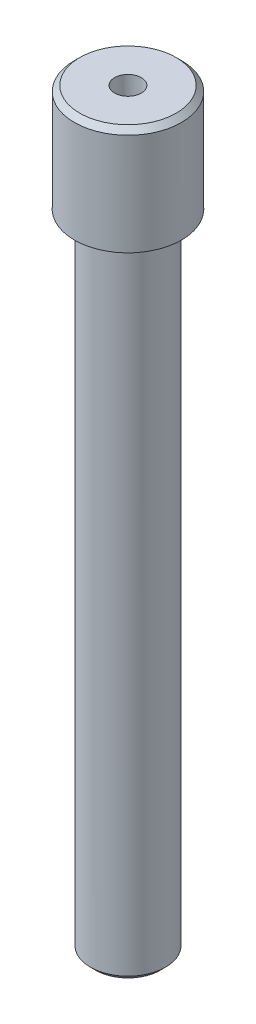
ISO-10303-21;
HEADER;
FILE_DESCRIPTION(('STEP AP214'),'2;1');
FILE_NAME('part.step','',(''),(''),'','','');
FILE_SCHEMA(('AUTOMOTIVE_DESIGN { 1 0 10303 214 1 1 1 1 }'));
ENDSEC;
DATA;
#1=APPLICATION_CONTEXT('core data for automotive mechanical design processes');
#2=APPLICATION_PROTOCOL_DEFINITION('international standard','automotive_design',2000,#1);
#3=PRODUCT_CONTEXT('',#1,'mechanical');
#4=PRODUCT('Part','Part','',(#3));
#5=PRODUCT_RELATED_PRODUCT_CATEGORY('part','',(#4));
#6=PRODUCT_DEFINITION_FORMATION('','',#4);
#7=PRODUCT_DEFINITION_CONTEXT('part definition',#1,'design');
#8=PRODUCT_DEFINITION('design','',#6,#7);
#9=PRODUCT_DEFINITION_SHAPE('','',#8);
#10=(LENGTH_UNIT() NAMED_UNIT(*) SI_UNIT(.MILLI.,.METRE.));
#11=(NAMED_UNIT(*) PLANE_ANGLE_UNIT() SI_UNIT($,.RADIAN.));
#12=(NAMED_UNIT(*) SI_UNIT($,.STERADIAN.) SOLID_ANGLE_UNIT());
#13=UNCERTAINTY_MEASURE_WITH_UNIT(LENGTH_MEASURE(1.E-05),#10,'distance_accuracy_value','');
#14=(GEOMETRIC_REPRESENTATION_CONTEXT(3) GLOBAL_UNCERTAINTY_ASSIGNED_CONTEXT((#13)) GLOBAL_UNIT_ASSIGNED_CONTEXT((#10,
#11,#12)) REPRESENTATION_CONTEXT('',''));
#15=CARTESIAN_POINT('',(0.,0.,0.));
#16=DIRECTION('',(0.,0.,1.));
#17=DIRECTION('',(1.,0.,0.));
#18=AXIS2_PLACEMENT_3D('',#15,#16,#17);
#19=CARTESIAN_POINT('',(0.,102.6727408751,0.));
#20=DIRECTION('',(0.,1.,0.));
#21=DIRECTION('',(0.,0.,1.));
#22=AXIS2_PLACEMENT_3D('',#19,#20,#21);
#23=CYLINDRICAL_SURFACE('',#22,3.);
#24=CARTESIAN_POINT('',(0.,120.,0.));
#25=DIRECTION('',(0.,1.,0.));
#26=DIRECTION('',(0.,0.,1.));
#27=AXIS2_PLACEMENT_3D('',#24,#25,#26);
#28=CIRCLE('',#27,3.);
#29=CARTESIAN_POINT('',(0.,120.,3.));
#30=VERTEX_POINT('',#29);
#31=EDGE_CURVE('P0_E11',#30,#30,#28,.F.);
#32=ORIENTED_EDGE('',*,*,#31,.T.);
#33=EDGE_LOOP('',(#32));
#34=FACE_BOUND('',#33,.T.);
#35=CARTESIAN_POINT('',(0.,108.,0.));
#36=DIRECTION('',(0.,1.,0.));
#37=DIRECTION('',(0.,0.,1.));
#38=AXIS2_PLACEMENT_3D('',#35,#36,#37);
#39=CIRCLE('',#38,3.);
#40=CARTESIAN_POINT('',(0.,108.,3.));
#41=VERTEX_POINT('',#40);
#42=EDGE_CURVE('P0_E20',#41,#41,#39,.T.);
#43=ORIENTED_EDGE('',*,*,#42,.T.);
#44=EDGE_LOOP('',(#43));
#45=FACE_BOUND('',#44,.T.);
#46=ADVANCED_FACE('P0_F16',(#34,#45),#23,.T.);
#47=CARTESIAN_POINT('',(0.,108.,0.));
#48=DIRECTION('',(0.,1.,0.));
#49=DIRECTION('',(1.,0.,0.));
#50=AXIS2_PLACEMENT_3D('',#47,#48,#49);
#51=PLANE('',#50);
#52=ORIENTED_EDGE('',*,*,#42,.F.);
#53=EDGE_LOOP('',(#52));
#54=FACE_BOUND('',#53,.T.);
#55=CARTESIAN_POINT('',(2.5,108.,0.));
#56=CARTESIAN_POINT('',(2.5,108.,0.476157830251407));
#57=CARTESIAN_POINT('',(2.32447075265609,108.,0.920236773904654));
#58=CARTESIAN_POINT('',(2.13467172654282,108.,1.40041744064935));
#59=CARTESIAN_POINT('',(1.76776695296639,108.,1.76776695296634));
#60=CARTESIAN_POINT('',(1.40299952199025,108.,2.13297653193165));
#61=CARTESIAN_POINT('',(0.920236773904714,108.,2.32447075265606));
#62=CARTESIAN_POINT('',(0.478454048475388,108.,2.49970970609869));
#63=CARTESIAN_POINT('',(0.,108.,2.5));
#64=CARTESIAN_POINT('',(-0.47542805843493,108.,2.50028845793303));
#65=CARTESIAN_POINT('',(-0.920236773904648,108.,2.32447075265609));
#66=CARTESIAN_POINT('',(-1.40041744796297,108.,2.13467171928482));
#67=CARTESIAN_POINT('',(-1.76776695296635,108.,1.76776695296639));
#68=CARTESIAN_POINT('',(-2.13297687940409,108.,1.402999174892));
#69=CARTESIAN_POINT('',(-2.32447075265607,108.,0.920236773904695));
#70=CARTESIAN_POINT('',(-2.5,108.,0.477721723933663));
#71=CARTESIAN_POINT('',(-2.5,108.,0.));
#72=B_SPLINE_CURVE_WITH_KNOTS('',2,(#55,#56,#57,#58,#59,#60,#61,#62,#63,#64,#65,#66,#67,#68,#69,
#70,#71),.UNSPECIFIED.,.F.,.F.,(3,2,2,2,2,2,2,2,3),(0.,0.125,0.25,0.375,0.5,0.625,0.75,0.875,
1.),.UNSPECIFIED.);
#73=CARTESIAN_POINT('',(2.5,108.,0.));
#74=VERTEX_POINT('',#73);
#75=CARTESIAN_POINT('',(-2.5,108.,0.));
#76=VERTEX_POINT('',#75);
#77=EDGE_CURVE('P0_E31',#74,#76,#72,.T.);
#78=ORIENTED_EDGE('',*,*,#77,.F.);
#79=CARTESIAN_POINT('',(-2.5,108.,0.));
#80=CARTESIAN_POINT('',(-2.5,108.,-0.476157830251407));
#81=CARTESIAN_POINT('',(-2.32447075265609,108.,-0.920236773904654));
#82=CARTESIAN_POINT('',(-2.13467172654282,108.,-1.40041744064935));
#83=CARTESIAN_POINT('',(-1.76776695296639,108.,-1.76776695296634));
#84=CARTESIAN_POINT('',(-1.40299952199025,108.,-2.13297653193165));
#85=CARTESIAN_POINT('',(-0.920236773904714,108.,-2.32447075265606));
#86=CARTESIAN_POINT('',(-0.478454048475388,108.,-2.49970970609869));
#87=CARTESIAN_POINT('',(0.,108.,-2.5));
#88=CARTESIAN_POINT('',(0.47542805843493,108.,-2.50028845793303));
#89=CARTESIAN_POINT('',(0.920236773904648,108.,-2.32447075265609));
#90=CARTESIAN_POINT('',(1.40041744796297,108.,-2.13467171928482));
#91=CARTESIAN_POINT('',(1.76776695296635,108.,-1.76776695296639));
#92=CARTESIAN_POINT('',(2.13297687940409,108.,-1.402999174892));
#93=CARTESIAN_POINT('',(2.32447075265607,108.,-0.920236773904695));
#94=CARTESIAN_POINT('',(2.5,108.,-0.477721723933663));
#95=CARTESIAN_POINT('',(2.5,108.,0.));
#96=B_SPLINE_CURVE_WITH_KNOTS('',2,(#79,#80,#81,#82,#83,#84,#85,#86,#87,#88,#89,#90,#91,#92,#93,
#94,#95),.UNSPECIFIED.,.F.,.F.,(3,2,2,2,2,2,2,2,3),(0.,0.125,0.25,0.375,0.5,0.625,0.75,0.875,
1.),.UNSPECIFIED.);
#97=EDGE_CURVE('P0_E28',#76,#74,#96,.T.);
#98=ORIENTED_EDGE('',*,*,#97,.F.);
#99=EDGE_LOOP('',(#78,#98));
#100=FACE_BOUND('',#99,.T.);
#101=ADVANCED_FACE('P0_F17',(#54,#100),#51,.F.);
#102=OPEN_SHELL('',(#46,#101));
#103=SHELL_BASED_SURFACE_MODEL('P0_B1',(#102));
#104=CARTESIAN_POINT('',(0.,105.000000000018,0.));
#105=DIRECTION('',(0.,1.,0.));
#106=DIRECTION('',(0.,0.,1.));
#107=AXIS2_PLACEMENT_3D('',#104,#105,#106);
#108=CONICAL_SURFACE('',#107,2.50000000011141,1.02974425851488);
#109=CARTESIAN_POINT('',(0.,103.497848451832,0.));
#110=VERTEX_POINT('',#109);
#111=VERTEX_LOOP('',#110);
#112=FACE_BOUND('',#111,.T.);
#113=CARTESIAN_POINT('',(0.,104.999999999964,0.));
#114=DIRECTION('',(0.,1.,0.));
#115=DIRECTION('',(0.,0.,1.));
#116=AXIS2_PLACEMENT_3D('',#113,#114,#115);
#117=CIRCLE('',#116,2.50000000002154);
#118=CARTESIAN_POINT('',(0.,104.999999999964,2.50000000002154));
#119=VERTEX_POINT('',#118);
#120=EDGE_CURVE('P1_E19',#119,#119,#117,.T.);
#121=ORIENTED_EDGE('',*,*,#120,.T.);
#122=EDGE_LOOP('',(#121));
#123=FACE_BOUND('',#122,.T.);
#124=ADVANCED_FACE('P1_F16',(#112,#123),#108,.F.);
#125=CARTESIAN_POINT('',(0.,102.6727408751,0.));
#126=DIRECTION('',(0.,1.,0.));
#127=DIRECTION('',(0.,0.,1.));
#128=AXIS2_PLACEMENT_3D('',#125,#126,#127);
#129=CYLINDRICAL_SURFACE('',#128,2.5);
#130=ORIENTED_EDGE('',*,*,#120,.F.);
#131=EDGE_LOOP('',(#130));
#132=FACE_BOUND('',#131,.T.);
#133=CARTESIAN_POINT('',(0.,120.,0.));
#134=DIRECTION('',(0.,1.,0.));
#135=DIRECTION('',(0.,0.,1.));
#136=AXIS2_PLACEMENT_3D('',#133,#134,#135);
#137=CIRCLE('',#136,2.5);
#138=CARTESIAN_POINT('',(0.,120.,2.5));
#139=VERTEX_POINT('',#138);
#140=EDGE_CURVE('P1_E34',#139,#139,#137,.F.);
#141=ORIENTED_EDGE('',*,*,#140,.F.);
#142=EDGE_LOOP('',(#141));
#143=FACE_BOUND('',#142,.T.);
#144=ADVANCED_FACE('P1_F28',(#132,#143),#129,.F.);
#145=CARTESIAN_POINT('',(0.,120.,0.));
#146=DIRECTION('',(0.,1.,0.));
#147=DIRECTION('',(1.,0.,0.));
#148=AXIS2_PLACEMENT_3D('',#145,#146,#147);
#149=PLANE('',#148);
#150=ORIENTED_EDGE('',*,*,#140,.T.);
#151=EDGE_LOOP('',(#150));
#152=FACE_BOUND('',#151,.T.);
#153=CARTESIAN_POINT('',(0.,120.000000000003,0.));
#154=DIRECTION('',(0.,-1.,0.));
#155=DIRECTION('',(0.,0.,-1.));
#156=AXIS2_PLACEMENT_3D('',#153,#154,#155);
#157=CIRCLE('',#156,9.00000000000309);
#158=CARTESIAN_POINT('',(0.,120.000000000003,-9.00000000000309));
#159=VERTEX_POINT('',#158);
#160=EDGE_CURVE('P1_E41',#159,#159,#157,.T.);
#161=ORIENTED_EDGE('',*,*,#160,.F.);
#162=EDGE_LOOP('',(#161));
#163=FACE_BOUND('',#162,.T.);
#164=ADVANCED_FACE('P1_F139',(#152,#163),#149,.T.);
#165=CARTESIAN_POINT('',(0.,119.,0.));
#166=DIRECTION('',(0.,-1.,0.));
#167=DIRECTION('',(0.,0.,-1.));
#168=AXIS2_PLACEMENT_3D('',#165,#166,#167);
#169=CONICAL_SURFACE('',#168,10.0000000000058,0.785398163397296);
#170=CARTESIAN_POINT('',(0.,119.,0.));
#171=DIRECTION('',(0.,1.,0.));
#172=DIRECTION('',(0.,0.,1.));
#173=AXIS2_PLACEMENT_3D('',#170,#171,#172);
#174=CIRCLE('',#173,10.);
#175=CARTESIAN_POINT('',(0.,119.,10.));
#176=VERTEX_POINT('',#175);
#177=EDGE_CURVE('P1_E48',#176,#176,#174,.F.);
#178=ORIENTED_EDGE('',*,*,#177,.F.);
#179=EDGE_LOOP('',(#178));
#180=FACE_BOUND('',#179,.T.);
#181=ORIENTED_EDGE('',*,*,#160,.T.);
#182=EDGE_LOOP('',(#181));
#183=FACE_BOUND('',#182,.T.);
#184=ADVANCED_FACE('P1_F126',(#180,#183),#169,.T.);
#185=CARTESIAN_POINT('',(0.,0.,0.));
#186=DIRECTION('',(0.,1.,0.));
#187=DIRECTION('',(0.,0.,1.));
#188=AXIS2_PLACEMENT_3D('',#185,#186,#187);
#189=CYLINDRICAL_SURFACE('',#188,10.);
#190=ORIENTED_EDGE('',*,*,#177,.T.);
#191=EDGE_LOOP('',(#190));
#192=FACE_BOUND('',#191,.T.);
#193=CARTESIAN_POINT('',(0.,100.,0.));
#194=DIRECTION('',(0.,1.,0.));
#195=DIRECTION('',(0.,0.,1.));
#196=AXIS2_PLACEMENT_3D('',#193,#194,#195);
#197=CIRCLE('',#196,10.);
#198=CARTESIAN_POINT('',(0.,100.,10.));
#199=VERTEX_POINT('',#198);
#200=EDGE_CURVE('P1_E53',#199,#199,#197,.T.);
#201=ORIENTED_EDGE('',*,*,#200,.T.);
#202=EDGE_LOOP('',(#201));
#203=FACE_BOUND('',#202,.T.);
#204=ADVANCED_FACE('P1_F84',(#192,#203),#189,.T.);
#205=CARTESIAN_POINT('',(0.,-20.,0.));
#206=DIRECTION('',(0.,-1.,0.));
#207=DIRECTION('',(0.,0.,-1.));
#208=AXIS2_PLACEMENT_3D('',#205,#206,#207);
#209=PLANE('',#208);
#210=CARTESIAN_POINT('',(0.,-20.0000000000955,0.));
#211=DIRECTION('',(0.,1.,0.));
#212=DIRECTION('',(0.,0.,1.));
#213=AXIS2_PLACEMENT_3D('',#210,#211,#212);
#214=CIRCLE('',#213,5.99999999991497);
#215=CARTESIAN_POINT('',(0.,-20.0000000000955,5.99999999991497));
#216=VERTEX_POINT('',#215);
#217=EDGE_CURVE('P1_E59',#216,#216,#214,.T.);
#218=ORIENTED_EDGE('',*,*,#217,.F.);
#219=EDGE_LOOP('',(#218));
#220=FACE_BOUND('',#219,.T.);
#221=ADVANCED_FACE('P1_F73',(#220),#209,.T.);
#222=CARTESIAN_POINT('',(0.,100.,0.));
#223=DIRECTION('',(0.,1.,0.));
#224=DIRECTION('',(1.,0.,0.));
#225=AXIS2_PLACEMENT_3D('',#222,#223,#224);
#226=PLANE('',#225);
#227=ORIENTED_EDGE('',*,*,#200,.F.);
#228=EDGE_LOOP('',(#227));
#229=FACE_BOUND('',#228,.T.);
#230=CARTESIAN_POINT('',(0.,100.,0.));
#231=DIRECTION('',(0.,-1.,0.));
#232=DIRECTION('',(0.,0.,-1.));
#233=AXIS2_PLACEMENT_3D('',#230,#231,#232);
#234=CIRCLE('',#233,7.);
#235=CARTESIAN_POINT('',(0.,100.,-7.));
#236=VERTEX_POINT('',#235);
#237=EDGE_CURVE('P1_E24',#236,#236,#234,.T.);
#238=ORIENTED_EDGE('',*,*,#237,.F.);
#239=EDGE_LOOP('',(#238));
#240=FACE_BOUND('',#239,.T.);
#241=ADVANCED_FACE('P1_F67',(#229,#240),#226,.F.);
#242=CARTESIAN_POINT('',(0.,-19.0000000000623,0.));
#243=DIRECTION('',(0.,1.,0.));
#244=DIRECTION('',(0.,0.,1.));
#245=AXIS2_PLACEMENT_3D('',#242,#243,#244);
#246=CONICAL_SURFACE('',#245,6.99999999994816,0.785398163397448);
#247=CARTESIAN_POINT('',(0.,-19.,0.));
#248=DIRECTION('',(0.,-1.,0.));
#249=DIRECTION('',(0.,0.,-1.));
#250=AXIS2_PLACEMENT_3D('',#247,#248,#249);
#251=CIRCLE('',#250,7.);
#252=CARTESIAN_POINT('',(0.,-19.,-7.));
#253=VERTEX_POINT('',#252);
#254=EDGE_CURVE('P1_E11',#253,#253,#251,.F.);
#255=ORIENTED_EDGE('',*,*,#254,.F.);
#256=EDGE_LOOP('',(#255));
#257=FACE_BOUND('',#256,.T.);
#258=ORIENTED_EDGE('',*,*,#217,.T.);
#259=EDGE_LOOP('',(#258));
#260=FACE_BOUND('',#259,.T.);
#261=ADVANCED_FACE('P1_F71',(#257,#260),#246,.T.);
#262=CARTESIAN_POINT('',(0.,0.,0.));
#263=DIRECTION('',(0.,-1.,0.));
#264=DIRECTION('',(0.,0.,-1.));
#265=AXIS2_PLACEMENT_3D('',#262,#263,#264);
#266=CYLINDRICAL_SURFACE('',#265,7.);
#267=ORIENTED_EDGE('',*,*,#254,.T.);
#268=EDGE_LOOP('',(#267));
#269=FACE_BOUND('',#268,.T.);
#270=ORIENTED_EDGE('',*,*,#237,.T.);
#271=EDGE_LOOP('',(#270));
#272=FACE_BOUND('',#271,.T.);
#273=ADVANCED_FACE('P1_F70',(#269,#272),#266,.T.);
#274=CLOSED_SHELL('',(#124,#144,#164,#184,#204,#221,#241,#261,#273));
#275=MANIFOLD_SOLID_BREP('P1_B1',#274);
#276=ADVANCED_BREP_SHAPE_REPRESENTATION('',(#18,#275),#14);
#277=MANIFOLD_SURFACE_SHAPE_REPRESENTATION('',(#18,#103),#14);
#278=SHAPE_REPRESENTATION('',(#18),#14);
#279=SHAPE_DEFINITION_REPRESENTATION(#9,#278);
#280=SHAPE_REPRESENTATION_RELATIONSHIP('','',#278,#276);
#281=SHAPE_REPRESENTATION_RELATIONSHIP('','',#278,#277);
ENDSEC;
END-ISO-10303-21;
